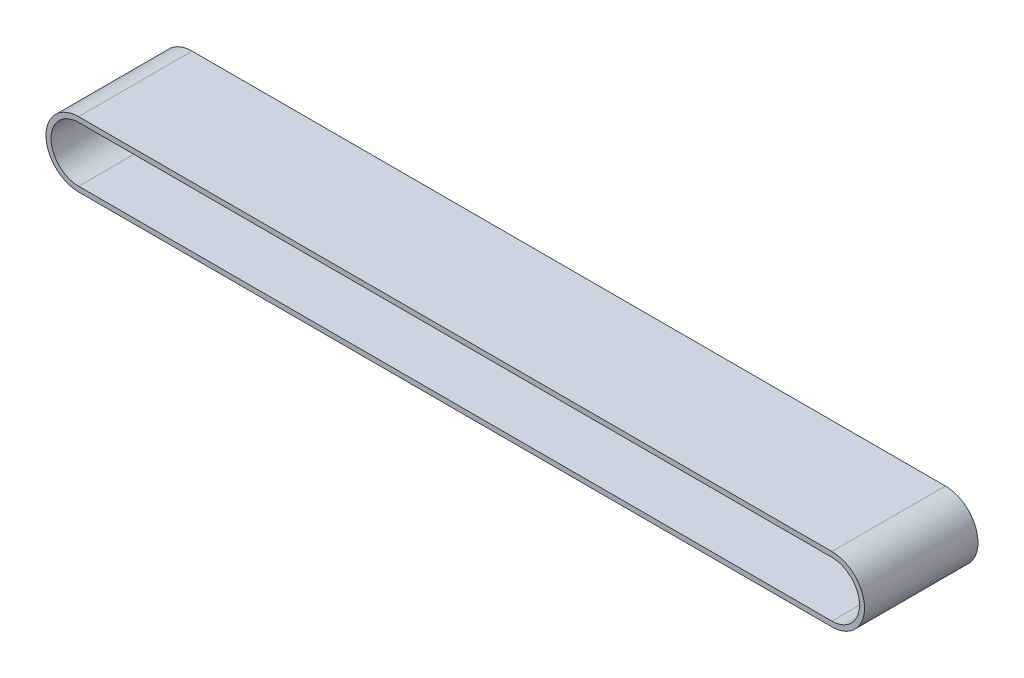
ISO-10303-21;
HEADER;
FILE_DESCRIPTION(('STEP AP214'),'2;1');
FILE_NAME('part.step','',(''),(''),'','','');
FILE_SCHEMA(('AUTOMOTIVE_DESIGN { 1 0 10303 214 1 1 1 1 }'));
ENDSEC;
DATA;
#1=APPLICATION_CONTEXT('core data for automotive mechanical design processes');
#2=APPLICATION_PROTOCOL_DEFINITION('international standard','automotive_design',2000,#1);
#3=PRODUCT_CONTEXT('',#1,'mechanical');
#4=PRODUCT('Part','Part','',(#3));
#5=PRODUCT_RELATED_PRODUCT_CATEGORY('part','',(#4));
#6=PRODUCT_DEFINITION_FORMATION('','',#4);
#7=PRODUCT_DEFINITION_CONTEXT('part definition',#1,'design');
#8=PRODUCT_DEFINITION('design','',#6,#7);
#9=PRODUCT_DEFINITION_SHAPE('','',#8);
#10=(LENGTH_UNIT() NAMED_UNIT(*) SI_UNIT(.MILLI.,.METRE.));
#11=(NAMED_UNIT(*) PLANE_ANGLE_UNIT() SI_UNIT($,.RADIAN.));
#12=(NAMED_UNIT(*) SI_UNIT($,.STERADIAN.) SOLID_ANGLE_UNIT());
#13=UNCERTAINTY_MEASURE_WITH_UNIT(LENGTH_MEASURE(1.E-05),#10,'distance_accuracy_value','');
#14=(GEOMETRIC_REPRESENTATION_CONTEXT(3) GLOBAL_UNCERTAINTY_ASSIGNED_CONTEXT((#13)) GLOBAL_UNIT_ASSIGNED_CONTEXT((#10,
#11,#12)) REPRESENTATION_CONTEXT('',''));
#15=CARTESIAN_POINT('',(0.,0.,0.));
#16=DIRECTION('',(0.,0.,1.));
#17=DIRECTION('',(1.,0.,0.));
#18=AXIS2_PLACEMENT_3D('',#15,#16,#17);
#19=CARTESIAN_POINT('',(-375.,0.,113.));
#20=DIRECTION('',(0.,0.,1.));
#21=DIRECTION('',(1.,0.,0.));
#22=AXIS2_PLACEMENT_3D('',#19,#20,#21);
#23=PLANE('',#22);
#24=CARTESIAN_POINT('',(-375.,0.,113.));
#25=DIRECTION('',(0.,0.,1.));
#26=DIRECTION('',(1.,0.,0.));
#27=AXIS2_PLACEMENT_3D('',#24,#25,#26);
#28=CIRCLE('',#27,32.5);
#29=CARTESIAN_POINT('',(-375.,32.5,113.));
#30=VERTEX_POINT('',#29);
#31=CARTESIAN_POINT('',(-375.,-32.5,113.));
#32=VERTEX_POINT('',#31);
#33=EDGE_CURVE('E133',#30,#32,#28,.T.);
#34=ORIENTED_EDGE('',*,*,#33,.T.);
#35=DIRECTION('',(1.,0.,0.));
#36=VECTOR('',#35,1.);
#37=CARTESIAN_POINT('',(-375.,-32.5,113.));
#38=LINE('',#37,#36);
#39=CARTESIAN_POINT('',(375.,-32.4999999999999,113.));
#40=VERTEX_POINT('',#39);
#41=EDGE_CURVE('E136',#32,#40,#38,.T.);
#42=ORIENTED_EDGE('',*,*,#41,.T.);
#43=CARTESIAN_POINT('',(375.,1.37772764904077E-13,113.));
#44=DIRECTION('',(0.,0.,1.));
#45=DIRECTION('',(1.,0.,0.));
#46=AXIS2_PLACEMENT_3D('',#43,#44,#45);
#47=CIRCLE('',#46,32.5);
#48=CARTESIAN_POINT('',(375.,32.5000000000001,113.));
#49=VERTEX_POINT('',#48);
#50=EDGE_CURVE('E139',#40,#49,#47,.T.);
#51=ORIENTED_EDGE('',*,*,#50,.T.);
#52=DIRECTION('',(-1.,0.,0.));
#53=VECTOR('',#52,1.);
#54=CARTESIAN_POINT('',(-375.,32.5,113.));
#55=LINE('',#54,#53);
#56=EDGE_CURVE('E141',#49,#30,#55,.T.);
#57=ORIENTED_EDGE('',*,*,#56,.T.);
#58=EDGE_LOOP('',(#34,#42,#51,#57));
#59=FACE_BOUND('',#58,.T.);
#60=DIRECTION('',(1.,0.,0.));
#61=VECTOR('',#60,1.);
#62=CARTESIAN_POINT('',(-375.,-27.5,113.));
#63=LINE('',#62,#61);
#64=CARTESIAN_POINT('',(-375.,-27.5,113.));
#65=VERTEX_POINT('',#64);
#66=CARTESIAN_POINT('',(375.,-27.4999999999998,113.));
#67=VERTEX_POINT('',#66);
#68=EDGE_CURVE('E105',#65,#67,#63,.T.);
#69=ORIENTED_EDGE('',*,*,#68,.F.);
#70=CARTESIAN_POINT('',(-375.,0.,113.));
#71=DIRECTION('',(0.,0.,1.));
#72=DIRECTION('',(1.,0.,0.));
#73=AXIS2_PLACEMENT_3D('',#70,#71,#72);
#74=CIRCLE('',#73,27.5);
#75=CARTESIAN_POINT('',(-375.,27.5,113.));
#76=VERTEX_POINT('',#75);
#77=EDGE_CURVE('E97',#76,#65,#74,.T.);
#78=ORIENTED_EDGE('',*,*,#77,.F.);
#79=DIRECTION('',(-1.,0.,0.));
#80=VECTOR('',#79,1.);
#81=CARTESIAN_POINT('',(-375.,27.5,113.));
#82=LINE('',#81,#80);
#83=CARTESIAN_POINT('',(375.,27.5,113.));
#84=VERTEX_POINT('',#83);
#85=EDGE_CURVE('E119',#84,#76,#82,.T.);
#86=ORIENTED_EDGE('',*,*,#85,.F.);
#87=CARTESIAN_POINT('',(375.,1.37772764904077E-13,113.));
#88=DIRECTION('',(0.,0.,1.));
#89=DIRECTION('',(1.,0.,0.));
#90=AXIS2_PLACEMENT_3D('',#87,#88,#89);
#91=CIRCLE('',#90,27.4999999999999);
#92=EDGE_CURVE('E117',#67,#84,#91,.T.);
#93=ORIENTED_EDGE('',*,*,#92,.F.);
#94=EDGE_LOOP('',(#69,#78,#86,#93));
#95=FACE_BOUND('',#94,.T.);
#96=ADVANCED_FACE('F32',(#59,#95),#23,.T.);
#97=CARTESIAN_POINT('',(-375.,0.,0.));
#98=DIRECTION('',(0.,0.,1.));
#99=DIRECTION('',(1.,0.,0.));
#100=AXIS2_PLACEMENT_3D('',#97,#98,#99);
#101=PLANE('',#100);
#102=CARTESIAN_POINT('',(-375.,0.,0.));
#103=DIRECTION('',(0.,0.,1.));
#104=DIRECTION('',(1.,0.,0.));
#105=AXIS2_PLACEMENT_3D('',#102,#103,#104);
#106=CIRCLE('',#105,32.5);
#107=CARTESIAN_POINT('',(-375.,32.5,0.));
#108=VERTEX_POINT('',#107);
#109=CARTESIAN_POINT('',(-375.,-32.5,0.));
#110=VERTEX_POINT('',#109);
#111=EDGE_CURVE('E113',#108,#110,#106,.T.);
#112=ORIENTED_EDGE('',*,*,#111,.F.);
#113=DIRECTION('',(-1.,0.,0.));
#114=VECTOR('',#113,1.);
#115=CARTESIAN_POINT('',(-375.,32.5,0.));
#116=LINE('',#115,#114);
#117=CARTESIAN_POINT('',(375.,32.5000000000001,0.));
#118=VERTEX_POINT('',#117);
#119=EDGE_CURVE('E137',#118,#108,#116,.T.);
#120=ORIENTED_EDGE('',*,*,#119,.F.);
#121=CARTESIAN_POINT('',(375.,1.37772764904077E-13,0.));
#122=DIRECTION('',(0.,0.,1.));
#123=DIRECTION('',(1.,0.,0.));
#124=AXIS2_PLACEMENT_3D('',#121,#122,#123);
#125=CIRCLE('',#124,32.5);
#126=CARTESIAN_POINT('',(375.,-32.4999999999999,0.));
#127=VERTEX_POINT('',#126);
#128=EDGE_CURVE('E148',#127,#118,#125,.T.);
#129=ORIENTED_EDGE('',*,*,#128,.F.);
#130=DIRECTION('',(1.,0.,0.));
#131=VECTOR('',#130,1.);
#132=CARTESIAN_POINT('',(-375.,-32.5,0.));
#133=LINE('',#132,#131);
#134=EDGE_CURVE('E146',#110,#127,#133,.T.);
#135=ORIENTED_EDGE('',*,*,#134,.F.);
#136=EDGE_LOOP('',(#112,#120,#129,#135));
#137=FACE_BOUND('',#136,.T.);
#138=CARTESIAN_POINT('',(-375.,0.,0.));
#139=DIRECTION('',(0.,0.,1.));
#140=DIRECTION('',(1.,0.,0.));
#141=AXIS2_PLACEMENT_3D('',#138,#139,#140);
#142=CIRCLE('',#141,27.5);
#143=CARTESIAN_POINT('',(-375.,27.5,0.));
#144=VERTEX_POINT('',#143);
#145=CARTESIAN_POINT('',(-375.,-27.5,0.));
#146=VERTEX_POINT('',#145);
#147=EDGE_CURVE('E55',#144,#146,#142,.T.);
#148=ORIENTED_EDGE('',*,*,#147,.T.);
#149=DIRECTION('',(1.,0.,0.));
#150=VECTOR('',#149,1.);
#151=CARTESIAN_POINT('',(-375.,-27.5,0.));
#152=LINE('',#151,#150);
#153=CARTESIAN_POINT('',(375.,-27.4999999999998,0.));
#154=VERTEX_POINT('',#153);
#155=EDGE_CURVE('E112',#146,#154,#152,.T.);
#156=ORIENTED_EDGE('',*,*,#155,.T.);
#157=CARTESIAN_POINT('',(375.,1.37772764904077E-13,0.));
#158=DIRECTION('',(0.,0.,1.));
#159=DIRECTION('',(1.,0.,0.));
#160=AXIS2_PLACEMENT_3D('',#157,#158,#159);
#161=CIRCLE('',#160,27.4999999999999);
#162=CARTESIAN_POINT('',(375.,27.5,0.));
#163=VERTEX_POINT('',#162);
#164=EDGE_CURVE('E125',#154,#163,#161,.T.);
#165=ORIENTED_EDGE('',*,*,#164,.T.);
#166=DIRECTION('',(-1.,0.,0.));
#167=VECTOR('',#166,1.);
#168=CARTESIAN_POINT('',(-375.,27.5,0.));
#169=LINE('',#168,#167);
#170=EDGE_CURVE('E106',#163,#144,#169,.T.);
#171=ORIENTED_EDGE('',*,*,#170,.T.);
#172=EDGE_LOOP('',(#148,#156,#165,#171));
#173=FACE_BOUND('',#172,.T.);
#174=ADVANCED_FACE('F166',(#137,#173),#101,.F.);
#175=CARTESIAN_POINT('',(-375.,0.,113.));
#176=DIRECTION('',(0.,0.,-1.));
#177=DIRECTION('',(-1.,0.,0.));
#178=AXIS2_PLACEMENT_3D('',#175,#176,#177);
#179=CYLINDRICAL_SURFACE('',#178,32.5);
#180=ORIENTED_EDGE('',*,*,#111,.T.);
#181=DIRECTION('',(0.,0.,-1.));
#182=VECTOR('',#181,1.);
#183=CARTESIAN_POINT('',(-375.,-32.5,113.));
#184=LINE('',#183,#182);
#185=EDGE_CURVE('E11',#32,#110,#184,.T.);
#186=ORIENTED_EDGE('',*,*,#185,.F.);
#187=ORIENTED_EDGE('',*,*,#33,.F.);
#188=DIRECTION('',(0.,0.,-1.));
#189=VECTOR('',#188,1.);
#190=CARTESIAN_POINT('',(-375.,32.5,113.));
#191=LINE('',#190,#189);
#192=EDGE_CURVE('E143',#30,#108,#191,.T.);
#193=ORIENTED_EDGE('',*,*,#192,.T.);
#194=EDGE_LOOP('',(#180,#186,#187,#193));
#195=FACE_BOUND('',#194,.T.);
#196=ADVANCED_FACE('F34',(#195),#179,.T.);
#197=CARTESIAN_POINT('',(-375.,-32.5,113.));
#198=DIRECTION('',(0.,1.,0.));
#199=DIRECTION('',(-1.,0.,0.));
#200=AXIS2_PLACEMENT_3D('',#197,#198,#199);
#201=PLANE('',#200);
#202=ORIENTED_EDGE('',*,*,#134,.T.);
#203=DIRECTION('',(0.,0.,-1.));
#204=VECTOR('',#203,1.);
#205=CARTESIAN_POINT('',(375.,-32.4999999999999,113.));
#206=LINE('',#205,#204);
#207=EDGE_CURVE('E40',#40,#127,#206,.T.);
#208=ORIENTED_EDGE('',*,*,#207,.F.);
#209=ORIENTED_EDGE('',*,*,#41,.F.);
#210=ORIENTED_EDGE('',*,*,#185,.T.);
#211=EDGE_LOOP('',(#202,#208,#209,#210));
#212=FACE_BOUND('',#211,.T.);
#213=ADVANCED_FACE('F176',(#212),#201,.F.);
#214=CARTESIAN_POINT('',(375.,1.37772764904077E-13,113.));
#215=DIRECTION('',(0.,0.,-1.));
#216=DIRECTION('',(-1.,0.,0.));
#217=AXIS2_PLACEMENT_3D('',#214,#215,#216);
#218=CYLINDRICAL_SURFACE('',#217,32.5);
#219=ORIENTED_EDGE('',*,*,#128,.T.);
#220=DIRECTION('',(0.,0.,-1.));
#221=VECTOR('',#220,1.);
#222=CARTESIAN_POINT('',(375.,32.5000000000001,113.));
#223=LINE('',#222,#221);
#224=EDGE_CURVE('E153',#49,#118,#223,.T.);
#225=ORIENTED_EDGE('',*,*,#224,.F.);
#226=ORIENTED_EDGE('',*,*,#50,.F.);
#227=ORIENTED_EDGE('',*,*,#207,.T.);
#228=EDGE_LOOP('',(#219,#225,#226,#227));
#229=FACE_BOUND('',#228,.T.);
#230=ADVANCED_FACE('F160',(#229),#218,.T.);
#231=CARTESIAN_POINT('',(-375.,32.5,113.));
#232=DIRECTION('',(0.,-1.,0.));
#233=DIRECTION('',(1.,0.,0.));
#234=AXIS2_PLACEMENT_3D('',#231,#232,#233);
#235=PLANE('',#234);
#236=ORIENTED_EDGE('',*,*,#119,.T.);
#237=ORIENTED_EDGE('',*,*,#192,.F.);
#238=ORIENTED_EDGE('',*,*,#56,.F.);
#239=ORIENTED_EDGE('',*,*,#224,.T.);
#240=EDGE_LOOP('',(#236,#237,#238,#239));
#241=FACE_BOUND('',#240,.T.);
#242=ADVANCED_FACE('F170',(#241),#235,.F.);
#243=CARTESIAN_POINT('',(-375.,0.,113.));
#244=DIRECTION('',(0.,0.,-1.));
#245=DIRECTION('',(-1.,0.,0.));
#246=AXIS2_PLACEMENT_3D('',#243,#244,#245);
#247=CYLINDRICAL_SURFACE('',#246,27.5);
#248=ORIENTED_EDGE('',*,*,#147,.F.);
#249=DIRECTION('',(0.,0.,-1.));
#250=VECTOR('',#249,1.);
#251=CARTESIAN_POINT('',(-375.,27.5,113.));
#252=LINE('',#251,#250);
#253=EDGE_CURVE('E101',#76,#144,#252,.T.);
#254=ORIENTED_EDGE('',*,*,#253,.F.);
#255=ORIENTED_EDGE('',*,*,#77,.T.);
#256=DIRECTION('',(0.,0.,-1.));
#257=VECTOR('',#256,1.);
#258=CARTESIAN_POINT('',(-375.,-27.5,113.));
#259=LINE('',#258,#257);
#260=EDGE_CURVE('E100',#65,#146,#259,.T.);
#261=ORIENTED_EDGE('',*,*,#260,.T.);
#262=EDGE_LOOP('',(#248,#254,#255,#261));
#263=FACE_BOUND('',#262,.T.);
#264=ADVANCED_FACE('F99',(#263),#247,.F.);
#265=CARTESIAN_POINT('',(-375.,-27.5,113.));
#266=DIRECTION('',(0.,1.,0.));
#267=DIRECTION('',(-1.,0.,0.));
#268=AXIS2_PLACEMENT_3D('',#265,#266,#267);
#269=PLANE('',#268);
#270=ORIENTED_EDGE('',*,*,#155,.F.);
#271=ORIENTED_EDGE('',*,*,#260,.F.);
#272=ORIENTED_EDGE('',*,*,#68,.T.);
#273=DIRECTION('',(0.,0.,-1.));
#274=VECTOR('',#273,1.);
#275=CARTESIAN_POINT('',(375.,-27.4999999999998,113.));
#276=LINE('',#275,#274);
#277=EDGE_CURVE('E114',#67,#154,#276,.T.);
#278=ORIENTED_EDGE('',*,*,#277,.T.);
#279=EDGE_LOOP('',(#270,#271,#272,#278));
#280=FACE_BOUND('',#279,.T.);
#281=ADVANCED_FACE('F109',(#280),#269,.T.);
#282=CARTESIAN_POINT('',(375.,1.37772764904077E-13,113.));
#283=DIRECTION('',(0.,0.,-1.));
#284=DIRECTION('',(-1.,0.,0.));
#285=AXIS2_PLACEMENT_3D('',#282,#283,#284);
#286=CYLINDRICAL_SURFACE('',#285,27.4999999999999);
#287=ORIENTED_EDGE('',*,*,#164,.F.);
#288=ORIENTED_EDGE('',*,*,#277,.F.);
#289=ORIENTED_EDGE('',*,*,#92,.T.);
#290=DIRECTION('',(0.,0.,-1.));
#291=VECTOR('',#290,1.);
#292=CARTESIAN_POINT('',(375.,27.5,113.));
#293=LINE('',#292,#291);
#294=EDGE_CURVE('E47',#84,#163,#293,.T.);
#295=ORIENTED_EDGE('',*,*,#294,.T.);
#296=EDGE_LOOP('',(#287,#288,#289,#295));
#297=FACE_BOUND('',#296,.T.);
#298=ADVANCED_FACE('F199',(#297),#286,.F.);
#299=CARTESIAN_POINT('',(-375.,27.5,113.));
#300=DIRECTION('',(0.,-1.,0.));
#301=DIRECTION('',(0.,0.,-1.));
#302=AXIS2_PLACEMENT_3D('',#299,#300,#301);
#303=PLANE('',#302);
#304=ORIENTED_EDGE('',*,*,#170,.F.);
#305=ORIENTED_EDGE('',*,*,#294,.F.);
#306=ORIENTED_EDGE('',*,*,#85,.T.);
#307=ORIENTED_EDGE('',*,*,#253,.T.);
#308=EDGE_LOOP('',(#304,#305,#306,#307));
#309=FACE_BOUND('',#308,.T.);
#310=ADVANCED_FACE('F203',(#309),#303,.T.);
#311=CLOSED_SHELL('',(#96,#174,#196,#213,#230,#242,#264,#281,#298,#310));
#312=MANIFOLD_SOLID_BREP('B2',#311);
#313=ADVANCED_BREP_SHAPE_REPRESENTATION('',(#18,#312),#14);
#314=SHAPE_DEFINITION_REPRESENTATION(#9,#313);
ENDSEC;
END-ISO-10303-21;
